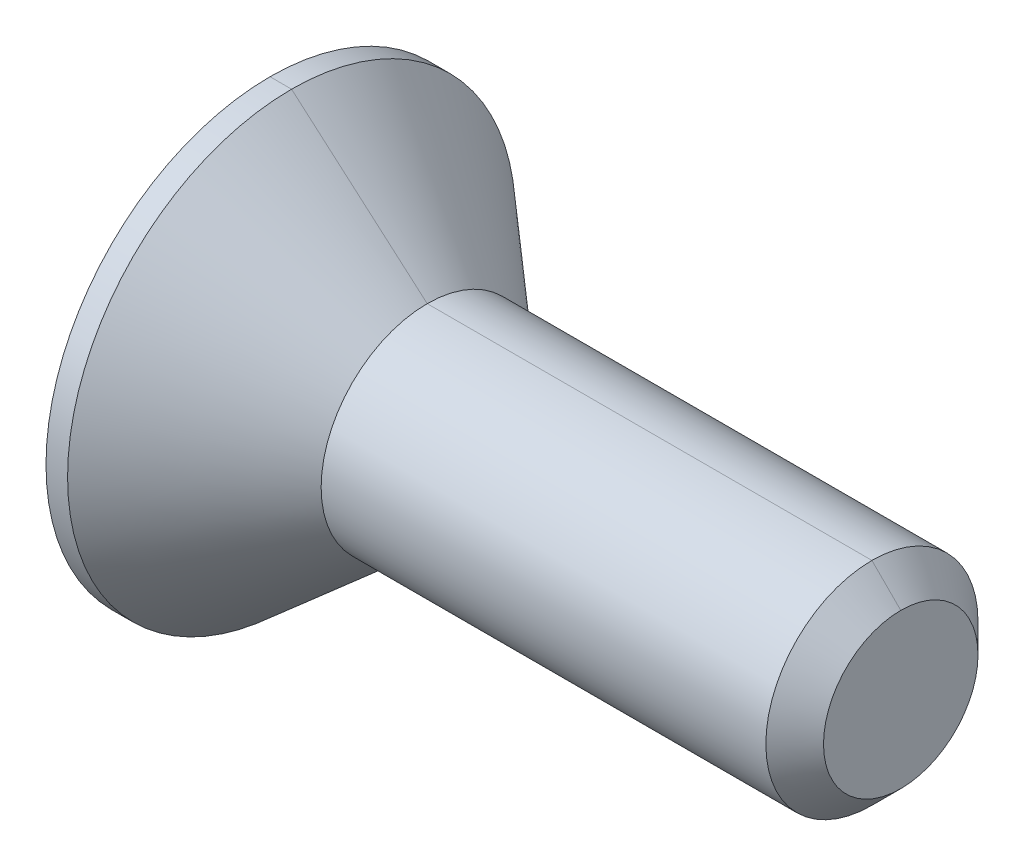
ISO-10303-21;
HEADER;
FILE_DESCRIPTION(('STEP AP214'),'2;1');
FILE_NAME('part.step','',(''),(''),'','','');
FILE_SCHEMA(('AUTOMOTIVE_DESIGN { 1 0 10303 214 1 1 1 1 }'));
ENDSEC;
DATA;
#1=APPLICATION_CONTEXT('core data for automotive mechanical design processes');
#2=APPLICATION_PROTOCOL_DEFINITION('international standard','automotive_design',2000,#1);
#3=PRODUCT_CONTEXT('',#1,'mechanical');
#4=PRODUCT('Part','Part','',(#3));
#5=PRODUCT_RELATED_PRODUCT_CATEGORY('part','',(#4));
#6=PRODUCT_DEFINITION_FORMATION('','',#4);
#7=PRODUCT_DEFINITION_CONTEXT('part definition',#1,'design');
#8=PRODUCT_DEFINITION('design','',#6,#7);
#9=PRODUCT_DEFINITION_SHAPE('','',#8);
#10=(LENGTH_UNIT() NAMED_UNIT(*) SI_UNIT(.MILLI.,.METRE.));
#11=(NAMED_UNIT(*) PLANE_ANGLE_UNIT() SI_UNIT($,.RADIAN.));
#12=(NAMED_UNIT(*) SI_UNIT($,.STERADIAN.) SOLID_ANGLE_UNIT());
#13=UNCERTAINTY_MEASURE_WITH_UNIT(LENGTH_MEASURE(1.E-05),#10,'distance_accuracy_value','');
#14=(GEOMETRIC_REPRESENTATION_CONTEXT(3) GLOBAL_UNCERTAINTY_ASSIGNED_CONTEXT((#13)) GLOBAL_UNIT_ASSIGNED_CONTEXT((#10,
#11,#12)) REPRESENTATION_CONTEXT('',''));
#15=CARTESIAN_POINT('',(0.,0.,0.));
#16=DIRECTION('',(0.,0.,1.));
#17=DIRECTION('',(1.,0.,0.));
#18=AXIS2_PLACEMENT_3D('',#15,#16,#17);
#19=CARTESIAN_POINT('',(-2.1082,0.454605601959952,-0.7874));
#20=DIRECTION('',(0.,-0.866025403784429,0.500000000000017));
#21=DIRECTION('',(0.,0.500000000000017,0.866025403784429));
#22=AXIS2_PLACEMENT_3D('',#19,#20,#21);
#23=PLANE('',#22);
#24=DIRECTION('',(-1.,0.,0.));
#25=VECTOR('',#24,1.);
#26=CARTESIAN_POINT('',(-0.711200244750286,0.909211203919889,0.));
#27=LINE('',#26,#25);
#28=CARTESIAN_POINT('',(-0.711200244750276,0.909211203919896,0.));
#29=VERTEX_POINT('',#28);
#30=CARTESIAN_POINT('',(-2.1082,0.909211203919887,0.));
#31=VERTEX_POINT('',#30);
#32=EDGE_CURVE('E267',#29,#31,#27,.T.);
#33=ORIENTED_EDGE('',*,*,#32,.T.);
#34=DIRECTION('',(0.,-0.500000000000017,-0.866025403784429));
#35=VECTOR('',#34,1.);
#36=CARTESIAN_POINT('',(-2.1082,0.909211203919884,0.));
#37=LINE('',#36,#35);
#38=CARTESIAN_POINT('',(-2.1082,0.454605601959952,-0.7874));
#39=VERTEX_POINT('',#38);
#40=EDGE_CURVE('E264',#31,#39,#37,.T.);
#41=ORIENTED_EDGE('',*,*,#40,.T.);
#42=DIRECTION('',(-1.,0.,0.));
#43=VECTOR('',#42,1.);
#44=CARTESIAN_POINT('',(-0.711200244750286,0.454605601959952,-0.7874));
#45=LINE('',#44,#43);
#46=CARTESIAN_POINT('',(-0.711200244750277,0.454605601959955,-0.787400000000009));
#47=VERTEX_POINT('',#46);
#48=EDGE_CURVE('E12',#47,#39,#45,.T.);
#49=ORIENTED_EDGE('',*,*,#48,.F.);
#50=CARTESIAN_POINT('',(-2.28599926574925,0.681908402939897,-0.393700000000035));
#51=DIRECTION('',(0.,-0.866025403784429,0.500000000000017));
#52=DIRECTION('',(0.960768876886009,-0.13867512863452,-0.240192368541127));
#53=AXIS2_PLACEMENT_3D('',#50,#51,#52);
#54=CIRCLE('',#53,1.63910286738593);
#55=EDGE_CURVE('E29',#47,#29,#54,.T.);
#56=ORIENTED_EDGE('',*,*,#55,.T.);
#57=EDGE_LOOP('',(#33,#41,#49,#56));
#58=FACE_BOUND('',#57,.T.);
#59=ADVANCED_FACE('F20',(#58),#23,.T.);
#60=CARTESIAN_POINT('',(-2.1082,-0.454605601959952,-0.7874));
#61=DIRECTION('',(0.,0.,1.));
#62=DIRECTION('',(0.,1.,0.));
#63=AXIS2_PLACEMENT_3D('',#60,#61,#62);
#64=PLANE('',#63);
#65=ORIENTED_EDGE('',*,*,#48,.T.);
#66=DIRECTION('',(0.,-1.,0.));
#67=VECTOR('',#66,1.);
#68=CARTESIAN_POINT('',(-2.1082,0.454605601959952,-0.7874));
#69=LINE('',#68,#67);
#70=CARTESIAN_POINT('',(-2.1082,-0.454605601959964,-0.787400000000003));
#71=VERTEX_POINT('',#70);
#72=EDGE_CURVE('E256',#39,#71,#69,.T.);
#73=ORIENTED_EDGE('',*,*,#72,.T.);
#74=DIRECTION('',(-1.,0.,0.));
#75=VECTOR('',#74,1.);
#76=CARTESIAN_POINT('',(-0.711200244750293,-0.454605601959952,-0.7874));
#77=LINE('',#76,#75);
#78=CARTESIAN_POINT('',(-0.711200244750276,-0.454605601959967,-0.787400000000007));
#79=VERTEX_POINT('',#78);
#80=EDGE_CURVE('E41',#79,#71,#77,.T.);
#81=ORIENTED_EDGE('',*,*,#80,.F.);
#82=CARTESIAN_POINT('',(-2.28599926574925,0.,-0.7874));
#83=DIRECTION('',(0.,0.,1.));
#84=DIRECTION('',(0.960768876885996,-0.277350257269074,0.));
#85=AXIS2_PLACEMENT_3D('',#82,#83,#84);
#86=CIRCLE('',#85,1.63910286738595);
#87=EDGE_CURVE('E234',#79,#47,#86,.T.);
#88=ORIENTED_EDGE('',*,*,#87,.T.);
#89=EDGE_LOOP('',(#65,#73,#81,#88));
#90=FACE_BOUND('',#89,.T.);
#91=ADVANCED_FACE('F304',(#90),#64,.T.);
#92=CARTESIAN_POINT('',(-2.28599926574925,0.,0.));
#93=DIRECTION('',(1.,0.,0.));
#94=DIRECTION('',(0.,-1.,0.));
#95=AXIS2_PLACEMENT_3D('',#92,#93,#94);
#96=SPHERICAL_SURFACE('',#95,1.81842156);
#97=CARTESIAN_POINT('',(-2.28599926574925,0.,0.));
#98=DIRECTION('',(0.,0.,1.));
#99=DIRECTION('',(0.866025269189491,-0.500000233125215,0.));
#100=AXIS2_PLACEMENT_3D('',#97,#98,#99);
#101=CIRCLE('',#100,1.81842156);
#102=CARTESIAN_POINT('',(-0.711200244750272,-0.909211203919897,0.));
#103=VERTEX_POINT('',#102);
#104=CARTESIAN_POINT('',(-0.467577705749246,0.,0.));
#105=VERTEX_POINT('',#104);
#106=EDGE_CURVE('E241',#103,#105,#101,.T.);
#107=ORIENTED_EDGE('',*,*,#106,.T.);
#108=CARTESIAN_POINT('',(-2.28599926574925,0.,0.));
#109=DIRECTION('',(0.,0.,-1.));
#110=DIRECTION('',(0.866025269189494,0.500000233125211,0.));
#111=AXIS2_PLACEMENT_3D('',#108,#109,#110);
#112=CIRCLE('',#111,1.81842156);
#113=EDGE_CURVE('E230',#29,#105,#112,.T.);
#114=ORIENTED_EDGE('',*,*,#113,.F.);
#115=ORIENTED_EDGE('',*,*,#55,.F.);
#116=ORIENTED_EDGE('',*,*,#87,.F.);
#117=CARTESIAN_POINT('',(-2.28599926574925,-0.681908402939913,-0.393700000000044));
#118=DIRECTION('',(0.,0.866025403784429,0.500000000000017));
#119=DIRECTION('',(0.960768876885994,-0.138675128634545,0.240192368541171));
#120=AXIS2_PLACEMENT_3D('',#117,#118,#119);
#121=CIRCLE('',#120,1.63910286738592);
#122=EDGE_CURVE('E229',#103,#79,#121,.T.);
#123=ORIENTED_EDGE('',*,*,#122,.F.);
#124=EDGE_LOOP('',(#107,#114,#115,#116,#123));
#125=FACE_BOUND('',#124,.T.);
#126=ADVANCED_FACE('F307',(#125),#96,.F.);
#127=CARTESIAN_POINT('',(-2.1082,-0.909211203919904,0.));
#128=DIRECTION('',(0.,0.866025403784429,0.500000000000017));
#129=DIRECTION('',(0.,0.500000000000017,-0.866025403784429));
#130=AXIS2_PLACEMENT_3D('',#127,#128,#129);
#131=PLANE('',#130);
#132=ORIENTED_EDGE('',*,*,#80,.T.);
#133=DIRECTION('',(0.,-0.500000000000017,0.866025403784429));
#134=VECTOR('',#133,1.);
#135=CARTESIAN_POINT('',(-2.1082,-0.454605601959972,-0.7874));
#136=LINE('',#135,#134);
#137=CARTESIAN_POINT('',(-2.1082,-0.909211203919904,0.));
#138=VERTEX_POINT('',#137);
#139=EDGE_CURVE('E248',#71,#138,#136,.T.);
#140=ORIENTED_EDGE('',*,*,#139,.T.);
#141=DIRECTION('',(-1.,0.,0.));
#142=VECTOR('',#141,1.);
#143=CARTESIAN_POINT('',(-0.711200244750286,-0.909211203919904,0.));
#144=LINE('',#143,#142);
#145=EDGE_CURVE('E225',#103,#138,#144,.T.);
#146=ORIENTED_EDGE('',*,*,#145,.F.);
#147=ORIENTED_EDGE('',*,*,#122,.T.);
#148=EDGE_LOOP('',(#132,#140,#146,#147));
#149=FACE_BOUND('',#148,.T.);
#150=ADVANCED_FACE('F246',(#149),#131,.T.);
#151=CARTESIAN_POINT('',(-2.1082,-0.909211203919904,0.));
#152=DIRECTION('',(0.,0.866025403784429,-0.500000000000017));
#153=DIRECTION('',(0.,0.500000000000017,0.866025403784429));
#154=AXIS2_PLACEMENT_3D('',#151,#152,#153);
#155=PLANE('',#154);
#156=DIRECTION('',(-1.,0.,0.));
#157=VECTOR('',#156,1.);
#158=CARTESIAN_POINT('',(-0.711200244750286,-0.454605601959967,0.787400000000009));
#159=LINE('',#158,#157);
#160=CARTESIAN_POINT('',(-0.711200244750277,-0.45460560195996,0.787400000000012));
#161=VERTEX_POINT('',#160);
#162=CARTESIAN_POINT('',(-2.1082,-0.454605601959964,0.787400000000003));
#163=VERTEX_POINT('',#162);
#164=EDGE_CURVE('E216',#161,#163,#159,.T.);
#165=ORIENTED_EDGE('',*,*,#164,.F.);
#166=CARTESIAN_POINT('',(-2.28599926574925,-0.681908402939913,0.393700000000044));
#167=DIRECTION('',(0.,0.866025403784429,-0.500000000000017));
#168=DIRECTION('',(0.960768876886009,0.138675128634519,0.240192368541127));
#169=AXIS2_PLACEMENT_3D('',#166,#167,#168);
#170=CIRCLE('',#169,1.63910286738592);
#171=EDGE_CURVE('E221',#161,#103,#170,.T.);
#172=ORIENTED_EDGE('',*,*,#171,.T.);
#173=ORIENTED_EDGE('',*,*,#145,.T.);
#174=DIRECTION('',(0.,0.500000000000017,0.866025403784429));
#175=VECTOR('',#174,1.);
#176=CARTESIAN_POINT('',(-2.1082,-0.909211203919904,0.));
#177=LINE('',#176,#175);
#178=EDGE_CURVE('E257',#138,#163,#177,.T.);
#179=ORIENTED_EDGE('',*,*,#178,.T.);
#180=EDGE_LOOP('',(#165,#172,#173,#179));
#181=FACE_BOUND('',#180,.T.);
#182=ADVANCED_FACE('F309',(#181),#155,.T.);
#183=CARTESIAN_POINT('',(-2.28599926574925,0.,0.));
#184=DIRECTION('',(1.,0.,0.));
#185=DIRECTION('',(0.,-1.,0.));
#186=AXIS2_PLACEMENT_3D('',#183,#184,#185);
#187=SPHERICAL_SURFACE('',#186,1.81842156);
#188=CARTESIAN_POINT('',(-2.28599926574925,0.,0.7874));
#189=DIRECTION('',(0.,0.,-1.));
#190=DIRECTION('',(0.960768876885996,0.277350257269074,0.));
#191=AXIS2_PLACEMENT_3D('',#188,#189,#190);
#192=CIRCLE('',#191,1.63910286738595);
#193=CARTESIAN_POINT('',(-0.711200244750276,0.454605601959962,0.787400000000005));
#194=VERTEX_POINT('',#193);
#195=EDGE_CURVE('E222',#194,#161,#192,.T.);
#196=ORIENTED_EDGE('',*,*,#195,.F.);
#197=CARTESIAN_POINT('',(-2.28599926574925,0.681908402939897,0.393700000000035));
#198=DIRECTION('',(0.,-0.866025403784429,-0.500000000000017));
#199=DIRECTION('',(0.960768876885994,0.138675128634545,-0.240192368541171));
#200=AXIS2_PLACEMENT_3D('',#197,#198,#199);
#201=CIRCLE('',#200,1.63910286738593);
#202=EDGE_CURVE('E271',#29,#194,#201,.T.);
#203=ORIENTED_EDGE('',*,*,#202,.F.);
#204=ORIENTED_EDGE('',*,*,#113,.T.);
#205=ORIENTED_EDGE('',*,*,#106,.F.);
#206=ORIENTED_EDGE('',*,*,#171,.F.);
#207=EDGE_LOOP('',(#196,#203,#204,#205,#206));
#208=FACE_BOUND('',#207,.T.);
#209=ADVANCED_FACE('F294',(#208),#187,.F.);
#210=CARTESIAN_POINT('',(-2.1082,-0.454605601959952,0.7874));
#211=DIRECTION('',(0.,0.,-1.));
#212=DIRECTION('',(0.,1.,0.));
#213=AXIS2_PLACEMENT_3D('',#210,#211,#212);
#214=PLANE('',#213);
#215=ORIENTED_EDGE('',*,*,#164,.T.);
#216=DIRECTION('',(0.,-1.,0.));
#217=VECTOR('',#216,1.);
#218=CARTESIAN_POINT('',(-2.1082,0.454605601959952,0.7874));
#219=LINE('',#218,#217);
#220=CARTESIAN_POINT('',(-2.1082,0.454605601959952,0.7874));
#221=VERTEX_POINT('',#220);
#222=EDGE_CURVE('E262',#221,#163,#219,.T.);
#223=ORIENTED_EDGE('',*,*,#222,.F.);
#224=DIRECTION('',(-1.,0.,0.));
#225=VECTOR('',#224,1.);
#226=CARTESIAN_POINT('',(-0.711200244750293,0.454605601959952,0.7874));
#227=LINE('',#226,#225);
#228=EDGE_CURVE('E272',#194,#221,#227,.T.);
#229=ORIENTED_EDGE('',*,*,#228,.F.);
#230=ORIENTED_EDGE('',*,*,#195,.T.);
#231=EDGE_LOOP('',(#215,#223,#229,#230));
#232=FACE_BOUND('',#231,.T.);
#233=ADVANCED_FACE('F301',(#232),#214,.T.);
#234=CARTESIAN_POINT('',(-2.1082,0.454605601959952,0.7874));
#235=DIRECTION('',(0.,-0.866025403784429,-0.500000000000017));
#236=DIRECTION('',(0.,0.500000000000017,-0.866025403784429));
#237=AXIS2_PLACEMENT_3D('',#234,#235,#236);
#238=PLANE('',#237);
#239=ORIENTED_EDGE('',*,*,#32,.F.);
#240=ORIENTED_EDGE('',*,*,#202,.T.);
#241=ORIENTED_EDGE('',*,*,#228,.T.);
#242=DIRECTION('',(0.,0.500000000000017,-0.866025403784429));
#243=VECTOR('',#242,1.);
#244=CARTESIAN_POINT('',(-2.1082,0.454605601959952,0.7874));
#245=LINE('',#244,#243);
#246=EDGE_CURVE('E209',#221,#31,#245,.T.);
#247=ORIENTED_EDGE('',*,*,#246,.T.);
#248=EDGE_LOOP('',(#239,#240,#241,#247));
#249=FACE_BOUND('',#248,.T.);
#250=ADVANCED_FACE('F289',(#249),#238,.T.);
#251=CARTESIAN_POINT('',(-2.1082,0.,0.));
#252=DIRECTION('',(1.,0.,0.));
#253=DIRECTION('',(0.,-1.,0.));
#254=AXIS2_PLACEMENT_3D('',#251,#252,#253);
#255=PLANE('',#254);
#256=ORIENTED_EDGE('',*,*,#222,.T.);
#257=ORIENTED_EDGE('',*,*,#178,.F.);
#258=ORIENTED_EDGE('',*,*,#139,.F.);
#259=ORIENTED_EDGE('',*,*,#72,.F.);
#260=ORIENTED_EDGE('',*,*,#40,.F.);
#261=ORIENTED_EDGE('',*,*,#246,.F.);
#262=EDGE_LOOP('',(#256,#257,#258,#259,#260,#261));
#263=FACE_BOUND('',#262,.T.);
#264=CARTESIAN_POINT('',(-2.1082,0.,0.));
#265=DIRECTION('',(1.,0.,0.));
#266=DIRECTION('',(0.,1.,0.));
#267=AXIS2_PLACEMENT_3D('',#264,#265,#266);
#268=CIRCLE('',#267,3.00355);
#269=CARTESIAN_POINT('',(-2.1082,3.00355,0.));
#270=VERTEX_POINT('',#269);
#271=CARTESIAN_POINT('',(-2.1082,-3.00355,0.));
#272=VERTEX_POINT('',#271);
#273=EDGE_CURVE('E180',#270,#272,#268,.T.);
#274=ORIENTED_EDGE('',*,*,#273,.F.);
#275=CARTESIAN_POINT('',(-2.1082,0.,0.));
#276=DIRECTION('',(1.,0.,0.));
#277=DIRECTION('',(0.,-1.,0.));
#278=AXIS2_PLACEMENT_3D('',#275,#276,#277);
#279=CIRCLE('',#278,3.00355);
#280=EDGE_CURVE('E181',#272,#270,#279,.T.);
#281=ORIENTED_EDGE('',*,*,#280,.F.);
#282=EDGE_LOOP('',(#274,#281));
#283=FACE_BOUND('',#282,.T.);
#284=ADVANCED_FACE('F253',(#263,#283),#255,.F.);
#285=CARTESIAN_POINT('',(-2.21361,0.,0.));
#286=DIRECTION('',(1.,0.,0.));
#287=DIRECTION('',(0.,-1.,0.));
#288=AXIS2_PLACEMENT_3D('',#285,#286,#287);
#289=CYLINDRICAL_SURFACE('',#288,3.00355);
#290=ORIENTED_EDGE('',*,*,#273,.T.);
#291=DIRECTION('',(1.,0.,0.));
#292=VECTOR('',#291,1.);
#293=CARTESIAN_POINT('',(-2.1082,-3.00355,0.));
#294=LINE('',#293,#292);
#295=CARTESIAN_POINT('',(-1.81890500707752,-3.00355000000004,0.));
#296=VERTEX_POINT('',#295);
#297=EDGE_CURVE('E176',#272,#296,#294,.T.);
#298=ORIENTED_EDGE('',*,*,#297,.T.);
#299=CARTESIAN_POINT('',(-1.81890500707749,0.,0.));
#300=DIRECTION('',(-1.,0.,0.));
#301=DIRECTION('',(0.,-1.,0.));
#302=AXIS2_PLACEMENT_3D('',#299,#300,#301);
#303=CIRCLE('',#302,3.00355000000007);
#304=CARTESIAN_POINT('',(-1.81890500707752,3.00355000000004,0.));
#305=VERTEX_POINT('',#304);
#306=EDGE_CURVE('E168',#296,#305,#303,.T.);
#307=ORIENTED_EDGE('',*,*,#306,.T.);
#308=DIRECTION('',(1.,0.,0.));
#309=VECTOR('',#308,1.);
#310=CARTESIAN_POINT('',(-2.1082,3.00355,0.));
#311=LINE('',#310,#309);
#312=EDGE_CURVE('E182',#270,#305,#311,.T.);
#313=ORIENTED_EDGE('',*,*,#312,.F.);
#314=EDGE_LOOP('',(#290,#298,#307,#313));
#315=FACE_BOUND('',#314,.T.);
#316=ADVANCED_FACE('F366',(#315),#289,.T.);
#317=CARTESIAN_POINT('',(-2.21361,0.,0.));
#318=DIRECTION('',(1.,0.,0.));
#319=DIRECTION('',(0.,-1.,0.));
#320=AXIS2_PLACEMENT_3D('',#317,#318,#319);
#321=CYLINDRICAL_SURFACE('',#320,3.00355);
#322=CARTESIAN_POINT('',(-1.81890500707749,0.,0.));
#323=DIRECTION('',(-1.,0.,0.));
#324=DIRECTION('',(0.,1.,0.));
#325=AXIS2_PLACEMENT_3D('',#322,#323,#324);
#326=CIRCLE('',#325,3.00355000000007);
#327=EDGE_CURVE('E169',#305,#296,#326,.T.);
#328=ORIENTED_EDGE('',*,*,#327,.T.);
#329=ORIENTED_EDGE('',*,*,#297,.F.);
#330=ORIENTED_EDGE('',*,*,#280,.T.);
#331=ORIENTED_EDGE('',*,*,#312,.T.);
#332=EDGE_LOOP('',(#328,#329,#330,#331));
#333=FACE_BOUND('',#332,.T.);
#334=ADVANCED_FACE('F374',(#333),#321,.T.);
#335=CARTESIAN_POINT('',(-0.3175,0.,0.));
#336=DIRECTION('',(1.,0.,0.));
#337=DIRECTION('',(0.,-1.,0.));
#338=AXIS2_PLACEMENT_3D('',#335,#336,#337);
#339=CYLINDRICAL_SURFACE('',#338,1.4224);
#340=DIRECTION('',(1.,0.,0.));
#341=VECTOR('',#340,1.);
#342=CARTESIAN_POINT('',(0.,1.4224,0.));
#343=LINE('',#342,#341);
#344=CARTESIAN_POINT('',(0.,1.42240000000002,0.));
#345=VERTEX_POINT('',#344);
#346=CARTESIAN_POINT('',(5.963333186975,1.4224,0.));
#347=VERTEX_POINT('',#346);
#348=EDGE_CURVE('E148',#345,#347,#343,.T.);
#349=ORIENTED_EDGE('',*,*,#348,.T.);
#350=CARTESIAN_POINT('',(5.963333186975,0.,0.));
#351=DIRECTION('',(-1.,0.,0.));
#352=DIRECTION('',(0.,1.,0.));
#353=AXIS2_PLACEMENT_3D('',#350,#351,#352);
#354=CIRCLE('',#353,1.4224);
#355=CARTESIAN_POINT('',(5.963333186975,-1.4224,0.));
#356=VERTEX_POINT('',#355);
#357=EDGE_CURVE('E121',#347,#356,#354,.T.);
#358=ORIENTED_EDGE('',*,*,#357,.T.);
#359=DIRECTION('',(1.,0.,0.));
#360=VECTOR('',#359,1.);
#361=CARTESIAN_POINT('',(0.,-1.4224,0.));
#362=LINE('',#361,#360);
#363=CARTESIAN_POINT('',(0.,-1.42240000000003,0.));
#364=VERTEX_POINT('',#363);
#365=EDGE_CURVE('E152',#364,#356,#362,.T.);
#366=ORIENTED_EDGE('',*,*,#365,.F.);
#367=CARTESIAN_POINT('',(0.,0.,0.));
#368=DIRECTION('',(1.,0.,0.));
#369=DIRECTION('',(0.,-1.,0.));
#370=AXIS2_PLACEMENT_3D('',#367,#368,#369);
#371=CIRCLE('',#370,1.42240000000005);
#372=EDGE_CURVE('E197',#364,#345,#371,.T.);
#373=ORIENTED_EDGE('',*,*,#372,.T.);
#374=EDGE_LOOP('',(#349,#358,#366,#373));
#375=FACE_BOUND('',#374,.T.);
#376=ADVANCED_FACE('F383',(#375),#339,.T.);
#377=CARTESIAN_POINT('',(0.0363781001415926,0.,0.));
#378=DIRECTION('',(-1.,0.,0.));
#379=DIRECTION('',(0.,1.,0.));
#380=AXIS2_PLACEMENT_3D('',#377,#378,#379);
#381=CONICAL_SURFACE('',#380,1.39077700000005,0.715584993317675);
#382=DIRECTION('',(0.754709580222772,0.656059028990507,0.));
#383=VECTOR('',#382,1.);
#384=CARTESIAN_POINT('',(-1.81890500707749,-3.00355000000008,0.));
#385=LINE('',#384,#383);
#386=EDGE_CURVE('E163',#296,#364,#385,.T.);
#387=ORIENTED_EDGE('',*,*,#386,.F.);
#388=ORIENTED_EDGE('',*,*,#327,.F.);
#389=DIRECTION('',(0.754709580222772,-0.656059028990507,0.));
#390=VECTOR('',#389,1.);
#391=CARTESIAN_POINT('',(-1.81890500707749,3.00355000000008,0.));
#392=LINE('',#391,#390);
#393=EDGE_CURVE('E193',#305,#345,#392,.T.);
#394=ORIENTED_EDGE('',*,*,#393,.T.);
#395=ORIENTED_EDGE('',*,*,#372,.F.);
#396=EDGE_LOOP('',(#387,#388,#394,#395));
#397=FACE_BOUND('',#396,.T.);
#398=ADVANCED_FACE('F392',(#397),#381,.T.);
#399=CARTESIAN_POINT('',(0.0363781001415926,0.,0.));
#400=DIRECTION('',(-1.,0.,0.));
#401=DIRECTION('',(0.,1.,0.));
#402=AXIS2_PLACEMENT_3D('',#399,#400,#401);
#403=CONICAL_SURFACE('',#402,1.39077700000005,0.715584993317675);
#404=ORIENTED_EDGE('',*,*,#393,.F.);
#405=ORIENTED_EDGE('',*,*,#306,.F.);
#406=ORIENTED_EDGE('',*,*,#386,.T.);
#407=CARTESIAN_POINT('',(0.,0.,0.));
#408=DIRECTION('',(1.,0.,0.));
#409=DIRECTION('',(0.,1.,0.));
#410=AXIS2_PLACEMENT_3D('',#407,#408,#409);
#411=CIRCLE('',#410,1.42240000000005);
#412=EDGE_CURVE('E147',#345,#364,#411,.T.);
#413=ORIENTED_EDGE('',*,*,#412,.F.);
#414=EDGE_LOOP('',(#404,#405,#406,#413));
#415=FACE_BOUND('',#414,.T.);
#416=ADVANCED_FACE('F401',(#415),#403,.T.);
#417=CARTESIAN_POINT('',(-0.3175,0.,0.));
#418=DIRECTION('',(1.,0.,0.));
#419=DIRECTION('',(0.,-1.,0.));
#420=AXIS2_PLACEMENT_3D('',#417,#418,#419);
#421=CYLINDRICAL_SURFACE('',#420,1.4224);
#422=ORIENTED_EDGE('',*,*,#365,.T.);
#423=CARTESIAN_POINT('',(5.963333186975,0.,0.));
#424=DIRECTION('',(-1.,0.,0.));
#425=DIRECTION('',(0.,-1.,0.));
#426=AXIS2_PLACEMENT_3D('',#423,#424,#425);
#427=CIRCLE('',#426,1.4224);
#428=EDGE_CURVE('E140',#356,#347,#427,.T.);
#429=ORIENTED_EDGE('',*,*,#428,.T.);
#430=ORIENTED_EDGE('',*,*,#348,.F.);
#431=ORIENTED_EDGE('',*,*,#412,.T.);
#432=EDGE_LOOP('',(#422,#429,#430,#431));
#433=FACE_BOUND('',#432,.T.);
#434=ADVANCED_FACE('F410',(#433),#421,.T.);
#435=CARTESIAN_POINT('',(6.36017421200994,0.,0.));
#436=DIRECTION('',(-1.,0.,0.));
#437=DIRECTION('',(0.,1.,0.));
#438=AXIS2_PLACEMENT_3D('',#435,#436,#437);
#439=CONICAL_SURFACE('',#438,1.02555897496506,0.785398163397448);
#440=ORIENTED_EDGE('',*,*,#428,.F.);
#441=DIRECTION('',(0.707106781186548,0.707106781186547,0.));
#442=VECTOR('',#441,1.);
#443=CARTESIAN_POINT('',(5.963333186975,-1.4224,0.));
#444=LINE('',#443,#442);
#445=CARTESIAN_POINT('',(6.35,-1.035733186975,0.));
#446=VERTEX_POINT('',#445);
#447=EDGE_CURVE('E112',#356,#446,#444,.T.);
#448=ORIENTED_EDGE('',*,*,#447,.T.);
#449=CARTESIAN_POINT('',(6.35,0.,0.));
#450=DIRECTION('',(-1.,0.,0.));
#451=DIRECTION('',(0.,-1.,0.));
#452=AXIS2_PLACEMENT_3D('',#449,#450,#451);
#453=CIRCLE('',#452,1.035733186975);
#454=CARTESIAN_POINT('',(6.35,1.035733186975,0.));
#455=VERTEX_POINT('',#454);
#456=EDGE_CURVE('E105',#446,#455,#453,.T.);
#457=ORIENTED_EDGE('',*,*,#456,.T.);
#458=DIRECTION('',(0.707106781186548,-0.707106781186547,0.));
#459=VECTOR('',#458,1.);
#460=CARTESIAN_POINT('',(5.963333186975,1.4224,0.));
#461=LINE('',#460,#459);
#462=EDGE_CURVE('E109',#347,#455,#461,.T.);
#463=ORIENTED_EDGE('',*,*,#462,.F.);
#464=EDGE_LOOP('',(#440,#448,#457,#463));
#465=FACE_BOUND('',#464,.T.);
#466=ADVANCED_FACE('F108',(#465),#439,.T.);
#467=CARTESIAN_POINT('',(6.36017421200994,0.,0.));
#468=DIRECTION('',(-1.,0.,0.));
#469=DIRECTION('',(0.,1.,0.));
#470=AXIS2_PLACEMENT_3D('',#467,#468,#469);
#471=CONICAL_SURFACE('',#470,1.02555897496506,0.785398163397448);
#472=CARTESIAN_POINT('',(6.35,0.,0.));
#473=DIRECTION('',(-1.,0.,0.));
#474=DIRECTION('',(0.,1.,0.));
#475=AXIS2_PLACEMENT_3D('',#472,#473,#474);
#476=CIRCLE('',#475,1.035733186975);
#477=EDGE_CURVE('E117',#455,#446,#476,.T.);
#478=ORIENTED_EDGE('',*,*,#477,.T.);
#479=ORIENTED_EDGE('',*,*,#447,.F.);
#480=ORIENTED_EDGE('',*,*,#357,.F.);
#481=ORIENTED_EDGE('',*,*,#462,.T.);
#482=EDGE_LOOP('',(#478,#479,#480,#481));
#483=FACE_BOUND('',#482,.T.);
#484=ADVANCED_FACE('F120',(#483),#471,.T.);
#485=CARTESIAN_POINT('',(6.35,0.,0.));
#486=DIRECTION('',(1.,0.,0.));
#487=DIRECTION('',(0.,-1.,0.));
#488=AXIS2_PLACEMENT_3D('',#485,#486,#487);
#489=PLANE('',#488);
#490=ORIENTED_EDGE('',*,*,#456,.F.);
#491=ORIENTED_EDGE('',*,*,#477,.F.);
#492=EDGE_LOOP('',(#490,#491));
#493=FACE_BOUND('',#492,.T.);
#494=ADVANCED_FACE('F123',(#493),#489,.T.);
#495=CLOSED_SHELL('',(#59,#91,#126,#150,#182,#209,#233,#250,#284,#316,#334,#376,#398,#416,#434,
#466,#484,#494));
#496=MANIFOLD_SOLID_BREP('B1',#495);
#497=ADVANCED_BREP_SHAPE_REPRESENTATION('',(#18,#496),#14);
#498=SHAPE_DEFINITION_REPRESENTATION(#9,#497);
ENDSEC;
END-ISO-10303-21;
